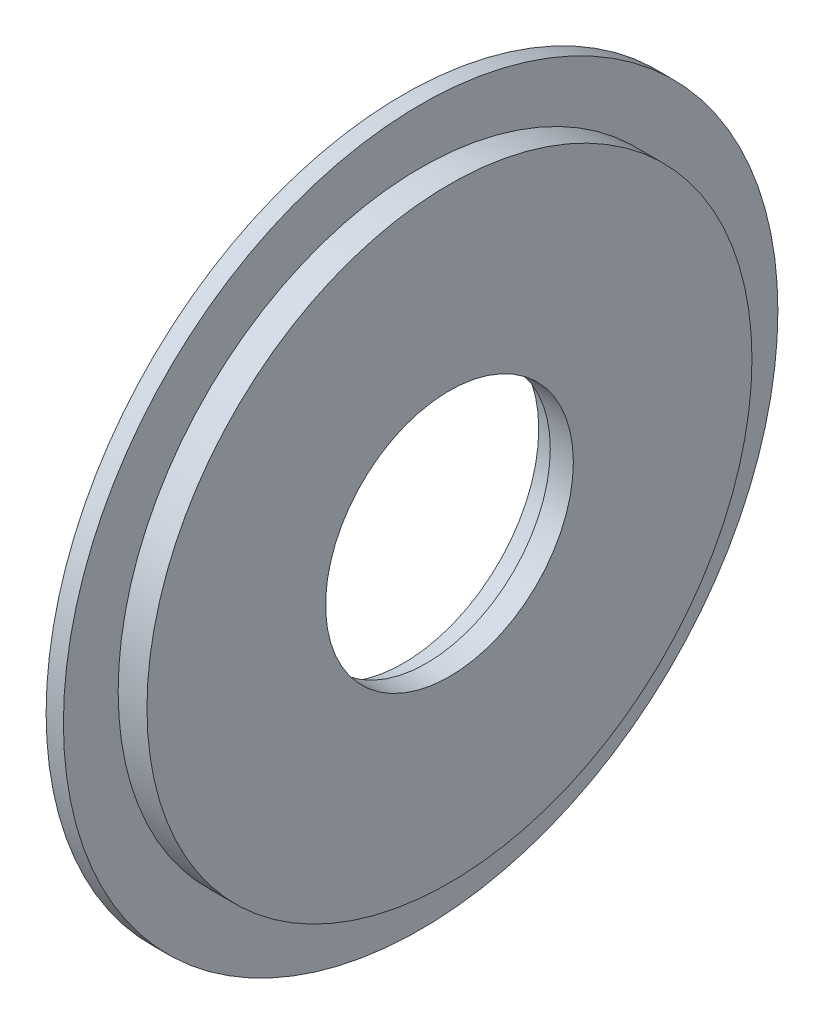
ISO-10303-21;
HEADER;
FILE_DESCRIPTION(('STEP AP214'),'2;1');
FILE_NAME('part.step','',(''),(''),'','','');
FILE_SCHEMA(('AUTOMOTIVE_DESIGN { 1 0 10303 214 1 1 1 1 }'));
ENDSEC;
DATA;
#1=APPLICATION_CONTEXT('core data for automotive mechanical design processes');
#2=APPLICATION_PROTOCOL_DEFINITION('international standard','automotive_design',2000,#1);
#3=PRODUCT_CONTEXT('',#1,'mechanical');
#4=PRODUCT('Part','Part','',(#3));
#5=PRODUCT_RELATED_PRODUCT_CATEGORY('part','',(#4));
#6=PRODUCT_DEFINITION_FORMATION('','',#4);
#7=PRODUCT_DEFINITION_CONTEXT('part definition',#1,'design');
#8=PRODUCT_DEFINITION('design','',#6,#7);
#9=PRODUCT_DEFINITION_SHAPE('','',#8);
#10=(LENGTH_UNIT() NAMED_UNIT(*) SI_UNIT(.MILLI.,.METRE.));
#11=(NAMED_UNIT(*) PLANE_ANGLE_UNIT() SI_UNIT($,.RADIAN.));
#12=(NAMED_UNIT(*) SI_UNIT($,.STERADIAN.) SOLID_ANGLE_UNIT());
#13=UNCERTAINTY_MEASURE_WITH_UNIT(LENGTH_MEASURE(1.E-05),#10,'distance_accuracy_value','');
#14=(GEOMETRIC_REPRESENTATION_CONTEXT(3) GLOBAL_UNCERTAINTY_ASSIGNED_CONTEXT((#13)) GLOBAL_UNIT_ASSIGNED_CONTEXT((#10,
#11,#12)) REPRESENTATION_CONTEXT('',''));
#15=CARTESIAN_POINT('',(0.,0.,0.));
#16=DIRECTION('',(0.,0.,1.));
#17=DIRECTION('',(1.,0.,0.));
#18=AXIS2_PLACEMENT_3D('',#15,#16,#17);
#19=CARTESIAN_POINT('',(-8.,0.,0.));
#20=DIRECTION('',(1.,0.,0.));
#21=DIRECTION('',(0.,0.,-1.));
#22=AXIS2_PLACEMENT_3D('',#19,#20,#21);
#23=CYLINDRICAL_SURFACE('',#22,62.);
#24=CARTESIAN_POINT('',(-8.,0.,0.));
#25=DIRECTION('',(1.,0.,0.));
#26=DIRECTION('',(0.,0.,-1.));
#27=AXIS2_PLACEMENT_3D('',#24,#25,#26);
#28=CIRCLE('',#27,62.);
#29=CARTESIAN_POINT('',(-8.,0.,-62.));
#30=VERTEX_POINT('',#29);
#31=EDGE_CURVE('E10',#30,#30,#28,.T.);
#32=ORIENTED_EDGE('',*,*,#31,.T.);
#33=EDGE_LOOP('',(#32));
#34=FACE_BOUND('',#33,.T.);
#35=CARTESIAN_POINT('',(-5.,0.,0.));
#36=DIRECTION('',(1.,0.,0.));
#37=DIRECTION('',(0.,0.,-1.));
#38=AXIS2_PLACEMENT_3D('',#35,#36,#37);
#39=CIRCLE('',#38,62.);
#40=CARTESIAN_POINT('',(-5.,0.,-62.));
#41=VERTEX_POINT('',#40);
#42=EDGE_CURVE('E52',#41,#41,#39,.T.);
#43=ORIENTED_EDGE('',*,*,#42,.F.);
#44=EDGE_LOOP('',(#43));
#45=FACE_BOUND('',#44,.T.);
#46=ADVANCED_FACE('F35',(#34,#45),#23,.T.);
#47=CARTESIAN_POINT('',(0.,0.,0.));
#48=DIRECTION('',(1.,0.,0.));
#49=DIRECTION('',(0.,0.,-1.));
#50=AXIS2_PLACEMENT_3D('',#47,#48,#49);
#51=PLANE('',#50);
#52=CARTESIAN_POINT('',(0.,0.,0.));
#53=DIRECTION('',(1.,0.,0.));
#54=DIRECTION('',(0.,0.,-1.));
#55=AXIS2_PLACEMENT_3D('',#52,#53,#54);
#56=CIRCLE('',#55,21.5);
#57=CARTESIAN_POINT('',(0.,0.,-21.5));
#58=VERTEX_POINT('',#57);
#59=EDGE_CURVE('E42',#58,#58,#56,.T.);
#60=ORIENTED_EDGE('',*,*,#59,.F.);
#61=EDGE_LOOP('',(#60));
#62=FACE_BOUND('',#61,.T.);
#63=CARTESIAN_POINT('',(0.,0.,0.));
#64=DIRECTION('',(1.,0.,0.));
#65=DIRECTION('',(0.,0.,-1.));
#66=AXIS2_PLACEMENT_3D('',#63,#64,#65);
#67=CIRCLE('',#66,52.5);
#68=CARTESIAN_POINT('',(0.,0.,-52.5));
#69=VERTEX_POINT('',#68);
#70=EDGE_CURVE('E58',#69,#69,#67,.T.);
#71=ORIENTED_EDGE('',*,*,#70,.T.);
#72=EDGE_LOOP('',(#71));
#73=FACE_BOUND('',#72,.T.);
#74=ADVANCED_FACE('F75',(#62,#73),#51,.T.);
#75=CARTESIAN_POINT('',(-8.,0.,0.));
#76=DIRECTION('',(1.,0.,0.));
#77=DIRECTION('',(0.,0.,-1.));
#78=AXIS2_PLACEMENT_3D('',#75,#76,#77);
#79=CYLINDRICAL_SURFACE('',#78,21.5);
#80=ORIENTED_EDGE('',*,*,#59,.T.);
#81=EDGE_LOOP('',(#80));
#82=FACE_BOUND('',#81,.T.);
#83=CARTESIAN_POINT('',(-4.,0.,0.));
#84=DIRECTION('',(-1.,0.,0.));
#85=DIRECTION('',(0.,0.,1.));
#86=AXIS2_PLACEMENT_3D('',#83,#84,#85);
#87=CIRCLE('',#86,21.5);
#88=CARTESIAN_POINT('',(-4.,0.,21.5));
#89=VERTEX_POINT('',#88);
#90=EDGE_CURVE('E38',#89,#89,#87,.F.);
#91=ORIENTED_EDGE('',*,*,#90,.F.);
#92=EDGE_LOOP('',(#91));
#93=FACE_BOUND('',#92,.T.);
#94=ADVANCED_FACE('F79',(#82,#93),#79,.F.);
#95=CARTESIAN_POINT('',(-8.,0.,0.));
#96=DIRECTION('',(1.,0.,0.));
#97=DIRECTION('',(0.,0.,-1.));
#98=AXIS2_PLACEMENT_3D('',#95,#96,#97);
#99=PLANE('',#98);
#100=CARTESIAN_POINT('',(-8.,0.,0.));
#101=DIRECTION('',(-1.,0.,0.));
#102=DIRECTION('',(0.,0.,1.));
#103=AXIS2_PLACEMENT_3D('',#100,#101,#102);
#104=CIRCLE('',#103,23.5);
#105=CARTESIAN_POINT('',(-8.,0.,23.5));
#106=VERTEX_POINT('',#105);
#107=EDGE_CURVE('E48',#106,#106,#104,.T.);
#108=ORIENTED_EDGE('',*,*,#107,.F.);
#109=EDGE_LOOP('',(#108));
#110=FACE_BOUND('',#109,.T.);
#111=ORIENTED_EDGE('',*,*,#31,.F.);
#112=EDGE_LOOP('',(#111));
#113=FACE_BOUND('',#112,.T.);
#114=ADVANCED_FACE('F84',(#110,#113),#99,.F.);
#115=CARTESIAN_POINT('',(-4.,0.,0.));
#116=DIRECTION('',(-1.,0.,0.));
#117=DIRECTION('',(0.,0.,1.));
#118=AXIS2_PLACEMENT_3D('',#115,#116,#117);
#119=PLANE('',#118);
#120=CARTESIAN_POINT('',(-4.,0.,0.));
#121=DIRECTION('',(-1.,0.,0.));
#122=DIRECTION('',(0.,0.,1.));
#123=AXIS2_PLACEMENT_3D('',#120,#121,#122);
#124=CIRCLE('',#123,23.5);
#125=CARTESIAN_POINT('',(-4.,0.,23.5));
#126=VERTEX_POINT('',#125);
#127=EDGE_CURVE('E51',#126,#126,#124,.T.);
#128=ORIENTED_EDGE('',*,*,#127,.T.);
#129=EDGE_LOOP('',(#128));
#130=FACE_BOUND('',#129,.T.);
#131=ORIENTED_EDGE('',*,*,#90,.T.);
#132=EDGE_LOOP('',(#131));
#133=FACE_BOUND('',#132,.T.);
#134=ADVANCED_FACE('F91',(#130,#133),#119,.T.);
#135=CARTESIAN_POINT('',(-4.,0.,0.));
#136=DIRECTION('',(-1.,0.,0.));
#137=DIRECTION('',(0.,0.,1.));
#138=AXIS2_PLACEMENT_3D('',#135,#136,#137);
#139=CYLINDRICAL_SURFACE('',#138,23.5);
#140=ORIENTED_EDGE('',*,*,#127,.F.);
#141=EDGE_LOOP('',(#140));
#142=FACE_BOUND('',#141,.T.);
#143=ORIENTED_EDGE('',*,*,#107,.T.);
#144=EDGE_LOOP('',(#143));
#145=FACE_BOUND('',#144,.T.);
#146=ADVANCED_FACE('F70',(#142,#145),#139,.F.);
#147=CARTESIAN_POINT('',(-5.,0.,0.));
#148=DIRECTION('',(1.,0.,0.));
#149=DIRECTION('',(0.,0.,-1.));
#150=AXIS2_PLACEMENT_3D('',#147,#148,#149);
#151=PLANE('',#150);
#152=CARTESIAN_POINT('',(-5.,0.,0.));
#153=DIRECTION('',(1.,0.,0.));
#154=DIRECTION('',(0.,0.,-1.));
#155=AXIS2_PLACEMENT_3D('',#152,#153,#154);
#156=CIRCLE('',#155,52.5);
#157=CARTESIAN_POINT('',(-5.,0.,-52.5));
#158=VERTEX_POINT('',#157);
#159=EDGE_CURVE('E57',#158,#158,#156,.T.);
#160=ORIENTED_EDGE('',*,*,#159,.F.);
#161=EDGE_LOOP('',(#160));
#162=FACE_BOUND('',#161,.T.);
#163=ORIENTED_EDGE('',*,*,#42,.T.);
#164=EDGE_LOOP('',(#163));
#165=FACE_BOUND('',#164,.T.);
#166=ADVANCED_FACE('F67',(#162,#165),#151,.T.);
#167=CARTESIAN_POINT('',(-5.,0.,0.));
#168=DIRECTION('',(1.,0.,0.));
#169=DIRECTION('',(0.,0.,-1.));
#170=AXIS2_PLACEMENT_3D('',#167,#168,#169);
#171=CYLINDRICAL_SURFACE('',#170,52.5);
#172=ORIENTED_EDGE('',*,*,#159,.T.);
#173=EDGE_LOOP('',(#172));
#174=FACE_BOUND('',#173,.T.);
#175=ORIENTED_EDGE('',*,*,#70,.F.);
#176=EDGE_LOOP('',(#175));
#177=FACE_BOUND('',#176,.T.);
#178=ADVANCED_FACE('F64',(#174,#177),#171,.T.);
#179=CLOSED_SHELL('',(#46,#74,#94,#114,#134,#146,#166,#178));
#180=MANIFOLD_SOLID_BREP('B2',#179);
#181=ADVANCED_BREP_SHAPE_REPRESENTATION('',(#18,#180),#14);
#182=SHAPE_DEFINITION_REPRESENTATION(#9,#181);
ENDSEC;
END-ISO-10303-21;
